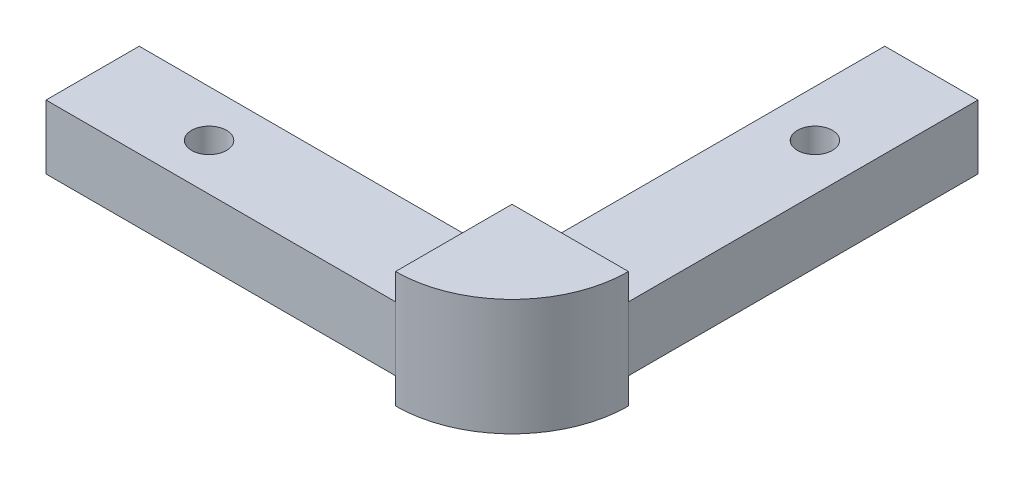
ISO-10303-21;
HEADER;
FILE_DESCRIPTION(('STEP AP214'),'2;1');
FILE_NAME('part.step','',(''),(''),'','','');
FILE_SCHEMA(('AUTOMOTIVE_DESIGN { 1 0 10303 214 1 1 1 1 }'));
ENDSEC;
DATA;
#1=APPLICATION_CONTEXT('core data for automotive mechanical design processes');
#2=APPLICATION_PROTOCOL_DEFINITION('international standard','automotive_design',2000,#1);
#3=PRODUCT_CONTEXT('',#1,'mechanical');
#4=PRODUCT('Part','Part','',(#3));
#5=PRODUCT_RELATED_PRODUCT_CATEGORY('part','',(#4));
#6=PRODUCT_DEFINITION_FORMATION('','',#4);
#7=PRODUCT_DEFINITION_CONTEXT('part definition',#1,'design');
#8=PRODUCT_DEFINITION('design','',#6,#7);
#9=PRODUCT_DEFINITION_SHAPE('','',#8);
#10=(LENGTH_UNIT() NAMED_UNIT(*) SI_UNIT(.MILLI.,.METRE.));
#11=(NAMED_UNIT(*) PLANE_ANGLE_UNIT() SI_UNIT($,.RADIAN.));
#12=(NAMED_UNIT(*) SI_UNIT($,.STERADIAN.) SOLID_ANGLE_UNIT());
#13=UNCERTAINTY_MEASURE_WITH_UNIT(LENGTH_MEASURE(1.E-05),#10,'distance_accuracy_value','');
#14=(GEOMETRIC_REPRESENTATION_CONTEXT(3) GLOBAL_UNCERTAINTY_ASSIGNED_CONTEXT((#13)) GLOBAL_UNIT_ASSIGNED_CONTEXT((#10,
#11,#12)) REPRESENTATION_CONTEXT('',''));
#15=CARTESIAN_POINT('',(0.,0.,0.));
#16=DIRECTION('',(0.,0.,1.));
#17=DIRECTION('',(1.,0.,0.));
#18=AXIS2_PLACEMENT_3D('',#15,#16,#17);
#19=CARTESIAN_POINT('',(-34.3342103379576,5.5,-14.7736082004496));
#20=DIRECTION('',(0.,1.,0.));
#21=DIRECTION('',(0.,0.,1.));
#22=AXIS2_PLACEMENT_3D('',#19,#20,#21);
#23=PLANE('',#22);
#24=CARTESIAN_POINT('',(-54.3342103379576,5.5,-8.77360820044956));
#25=DIRECTION('',(0.,1.,0.));
#26=DIRECTION('',(0.,0.,1.));
#27=AXIS2_PLACEMENT_3D('',#24,#25,#26);
#28=CIRCLE('',#27,1.5);
#29=CARTESIAN_POINT('',(-54.3342103379576,5.5,-7.27360820044956));
#30=VERTEX_POINT('',#29);
#31=EDGE_CURVE('E187',#30,#30,#28,.T.);
#32=ORIENTED_EDGE('',*,*,#31,.F.);
#33=EDGE_LOOP('',(#32));
#34=FACE_BOUND('',#33,.T.);
#35=DIRECTION('',(0.,0.,1.));
#36=VECTOR('',#35,1.);
#37=CARTESIAN_POINT('',(-34.3342103379576,5.5,-14.7736082004496));
#38=LINE('',#37,#36);
#39=CARTESIAN_POINT('',(-34.3342103379576,5.5,-12.7736082004496));
#40=VERTEX_POINT('',#39);
#41=CARTESIAN_POINT('',(-34.3342103379576,5.5,-4.77360820044956));
#42=VERTEX_POINT('',#41);
#43=EDGE_CURVE('E98',#40,#42,#38,.T.);
#44=ORIENTED_EDGE('',*,*,#43,.F.);
#45=DIRECTION('',(-1.,0.,0.));
#46=VECTOR('',#45,1.);
#47=CARTESIAN_POINT('',(-34.3342103379576,5.5,-12.7736082004496));
#48=LINE('',#47,#46);
#49=CARTESIAN_POINT('',(-64.3342103379576,5.5,-12.7736082004496));
#50=VERTEX_POINT('',#49);
#51=EDGE_CURVE('E154',#40,#50,#48,.T.);
#52=ORIENTED_EDGE('',*,*,#51,.T.);
#53=DIRECTION('',(0.,0.,1.));
#54=VECTOR('',#53,1.);
#55=CARTESIAN_POINT('',(-64.3342103379576,5.5,-4.77360820044956));
#56=LINE('',#55,#54);
#57=CARTESIAN_POINT('',(-64.3342103379576,5.5,-4.77360820044956));
#58=VERTEX_POINT('',#57);
#59=EDGE_CURVE('E241',#50,#58,#56,.T.);
#60=ORIENTED_EDGE('',*,*,#59,.T.);
#61=DIRECTION('',(1.,0.,0.));
#62=VECTOR('',#61,1.);
#63=CARTESIAN_POINT('',(-34.3342103379576,5.5,-4.77360820044957));
#64=LINE('',#63,#62);
#65=EDGE_CURVE('E120',#58,#42,#64,.T.);
#66=ORIENTED_EDGE('',*,*,#65,.T.);
#67=EDGE_LOOP('',(#44,#52,#60,#66));
#68=FACE_BOUND('',#67,.T.);
#69=ADVANCED_FACE('F41',(#34,#68),#23,.T.);
#70=CARTESIAN_POINT('',(-34.3342103379576,0.,-14.7736082004496));
#71=DIRECTION('',(0.,1.,0.));
#72=DIRECTION('',(0.,0.,1.));
#73=AXIS2_PLACEMENT_3D('',#70,#71,#72);
#74=PLANE('',#73);
#75=CARTESIAN_POINT('',(-54.3342103379576,0.,-8.77360820044956));
#76=DIRECTION('',(0.,1.,0.));
#77=DIRECTION('',(0.,0.,1.));
#78=AXIS2_PLACEMENT_3D('',#75,#76,#77);
#79=CIRCLE('',#78,1.5);
#80=CARTESIAN_POINT('',(-54.3342103379576,0.,-7.27360820044956));
#81=VERTEX_POINT('',#80);
#82=EDGE_CURVE('E45',#81,#81,#79,.T.);
#83=ORIENTED_EDGE('',*,*,#82,.T.);
#84=EDGE_LOOP('',(#83));
#85=FACE_BOUND('',#84,.T.);
#86=DIRECTION('',(-1.,0.,0.));
#87=VECTOR('',#86,1.);
#88=CARTESIAN_POINT('',(-34.3342103379576,0.,-12.7736082004496));
#89=LINE('',#88,#87);
#90=CARTESIAN_POINT('',(-34.3342103379576,0.,-12.7736082004496));
#91=VERTEX_POINT('',#90);
#92=CARTESIAN_POINT('',(-64.3342103379576,0.,-12.7736082004496));
#93=VERTEX_POINT('',#92);
#94=EDGE_CURVE('E136',#91,#93,#89,.T.);
#95=ORIENTED_EDGE('',*,*,#94,.F.);
#96=DIRECTION('',(0.,0.,1.));
#97=VECTOR('',#96,1.);
#98=CARTESIAN_POINT('',(-34.3342103379576,0.,-14.7736082004496));
#99=LINE('',#98,#97);
#100=CARTESIAN_POINT('',(-34.3342103379576,0.,-4.77360820044957));
#101=VERTEX_POINT('',#100);
#102=EDGE_CURVE('E11',#91,#101,#99,.T.);
#103=ORIENTED_EDGE('',*,*,#102,.T.);
#104=DIRECTION('',(1.,0.,0.));
#105=VECTOR('',#104,1.);
#106=CARTESIAN_POINT('',(-34.3342103379576,0.,-4.77360820044957));
#107=LINE('',#106,#105);
#108=CARTESIAN_POINT('',(-64.3342103379576,0.,-4.77360820044956));
#109=VERTEX_POINT('',#108);
#110=EDGE_CURVE('E142',#109,#101,#107,.T.);
#111=ORIENTED_EDGE('',*,*,#110,.F.);
#112=DIRECTION('',(0.,0.,1.));
#113=VECTOR('',#112,1.);
#114=CARTESIAN_POINT('',(-64.3342103379576,0.,-4.77360820044956));
#115=LINE('',#114,#113);
#116=EDGE_CURVE('E139',#93,#109,#115,.T.);
#117=ORIENTED_EDGE('',*,*,#116,.F.);
#118=EDGE_LOOP('',(#95,#103,#111,#117));
#119=FACE_BOUND('',#118,.T.);
#120=ADVANCED_FACE('F297',(#85,#119),#74,.F.);
#121=CARTESIAN_POINT('',(-34.3342103379576,5.5,-14.7736082004496));
#122=DIRECTION('',(1.,0.,0.));
#123=DIRECTION('',(0.,0.,-1.));
#124=AXIS2_PLACEMENT_3D('',#121,#122,#123);
#125=PLANE('',#124);
#126=DIRECTION('',(0.,-1.,0.));
#127=VECTOR('',#126,1.);
#128=CARTESIAN_POINT('',(-34.3342103379576,5.5,-14.7736082004496));
#129=LINE('',#128,#127);
#130=CARTESIAN_POINT('',(-34.3342103379576,7.75,-14.7736082004496));
#131=VERTEX_POINT('',#130);
#132=CARTESIAN_POINT('',(-34.3342103379576,-2.25,-14.7736082004496));
#133=VERTEX_POINT('',#132);
#134=EDGE_CURVE('E132',#131,#133,#129,.T.);
#135=ORIENTED_EDGE('',*,*,#134,.T.);
#136=DIRECTION('',(0.,0.,1.));
#137=VECTOR('',#136,1.);
#138=CARTESIAN_POINT('',(-34.3342103379576,-2.25,-14.7736082004496));
#139=LINE('',#138,#137);
#140=CARTESIAN_POINT('',(-34.3342103379576,-2.25,-4.77360820044957));
#141=VERTEX_POINT('',#140);
#142=EDGE_CURVE('E214',#133,#141,#139,.T.);
#143=ORIENTED_EDGE('',*,*,#142,.T.);
#144=DIRECTION('',(0.,1.,0.));
#145=VECTOR('',#144,1.);
#146=CARTESIAN_POINT('',(-34.3342103379576,-2.25,-4.77360820044957));
#147=LINE('',#146,#145);
#148=EDGE_CURVE('E231',#141,#101,#147,.T.);
#149=ORIENTED_EDGE('',*,*,#148,.T.);
#150=ORIENTED_EDGE('',*,*,#102,.F.);
#151=DIRECTION('',(0.,-1.,0.));
#152=VECTOR('',#151,1.);
#153=CARTESIAN_POINT('',(-34.3342103379576,5.5,-12.7736082004496));
#154=LINE('',#153,#152);
#155=EDGE_CURVE('E178',#40,#91,#154,.T.);
#156=ORIENTED_EDGE('',*,*,#155,.F.);
#157=ORIENTED_EDGE('',*,*,#43,.T.);
#158=CARTESIAN_POINT('',(-34.3342103379576,7.75,-4.77360820044957));
#159=VERTEX_POINT('',#158);
#160=EDGE_CURVE('E226',#42,#159,#147,.T.);
#161=ORIENTED_EDGE('',*,*,#160,.T.);
#162=DIRECTION('',(0.,0.,1.));
#163=VECTOR('',#162,1.);
#164=CARTESIAN_POINT('',(-34.3342103379576,7.75,-14.7736082004496));
#165=LINE('',#164,#163);
#166=EDGE_CURVE('E193',#131,#159,#165,.T.);
#167=ORIENTED_EDGE('',*,*,#166,.F.);
#168=EDGE_LOOP('',(#135,#143,#149,#150,#156,#157,#161,#167));
#169=FACE_BOUND('',#168,.T.);
#170=ADVANCED_FACE('F43',(#169),#125,.F.);
#171=CARTESIAN_POINT('',(-34.3342103379576,5.5,-12.7736082004496));
#172=DIRECTION('',(0.,0.,1.));
#173=DIRECTION('',(1.,0.,0.));
#174=AXIS2_PLACEMENT_3D('',#171,#172,#173);
#175=PLANE('',#174);
#176=ORIENTED_EDGE('',*,*,#94,.T.);
#177=DIRECTION('',(0.,-1.,0.));
#178=VECTOR('',#177,1.);
#179=CARTESIAN_POINT('',(-64.3342103379576,5.5,-12.7736082004496));
#180=LINE('',#179,#178);
#181=EDGE_CURVE('E174',#50,#93,#180,.T.);
#182=ORIENTED_EDGE('',*,*,#181,.F.);
#183=ORIENTED_EDGE('',*,*,#51,.F.);
#184=ORIENTED_EDGE('',*,*,#155,.T.);
#185=EDGE_LOOP('',(#176,#182,#183,#184));
#186=FACE_BOUND('',#185,.T.);
#187=ADVANCED_FACE('F300',(#186),#175,.F.);
#188=CARTESIAN_POINT('',(-64.3342103379576,5.5,-4.77360820044956));
#189=DIRECTION('',(1.,0.,0.));
#190=DIRECTION('',(0.,0.,-1.));
#191=AXIS2_PLACEMENT_3D('',#188,#189,#190);
#192=PLANE('',#191);
#193=ORIENTED_EDGE('',*,*,#116,.T.);
#194=DIRECTION('',(0.,-1.,0.));
#195=VECTOR('',#194,1.);
#196=CARTESIAN_POINT('',(-64.3342103379576,5.5,-4.77360820044956));
#197=LINE('',#196,#195);
#198=EDGE_CURVE('E170',#58,#109,#197,.T.);
#199=ORIENTED_EDGE('',*,*,#198,.F.);
#200=ORIENTED_EDGE('',*,*,#59,.F.);
#201=ORIENTED_EDGE('',*,*,#181,.T.);
#202=EDGE_LOOP('',(#193,#199,#200,#201));
#203=FACE_BOUND('',#202,.T.);
#204=ADVANCED_FACE('F302',(#203),#192,.F.);
#205=CARTESIAN_POINT('',(-34.3342103379576,5.5,-4.77360820044957));
#206=DIRECTION('',(0.,0.,-1.));
#207=DIRECTION('',(-1.,0.,0.));
#208=AXIS2_PLACEMENT_3D('',#205,#206,#207);
#209=PLANE('',#208);
#210=ORIENTED_EDGE('',*,*,#110,.T.);
#211=DIRECTION('',(0.,-1.,0.));
#212=VECTOR('',#211,1.);
#213=CARTESIAN_POINT('',(-34.3342103379576,5.5,-4.77360820044956));
#214=LINE('',#213,#212);
#215=EDGE_CURVE('E166',#42,#101,#214,.T.);
#216=ORIENTED_EDGE('',*,*,#215,.F.);
#217=ORIENTED_EDGE('',*,*,#65,.F.);
#218=ORIENTED_EDGE('',*,*,#198,.T.);
#219=EDGE_LOOP('',(#210,#216,#217,#218));
#220=FACE_BOUND('',#219,.T.);
#221=ADVANCED_FACE('F249',(#220),#209,.F.);
#222=CARTESIAN_POINT('',(-34.3342103379576,5.5,-14.7736082004496));
#223=DIRECTION('',(0.,-1.,0.));
#224=DIRECTION('',(0.,0.,-1.));
#225=AXIS2_PLACEMENT_3D('',#222,#223,#224);
#226=CYLINDRICAL_SURFACE('',#225,10.);
#227=ORIENTED_EDGE('',*,*,#215,.T.);
#228=ORIENTED_EDGE('',*,*,#148,.F.);
#229=CARTESIAN_POINT('',(-34.3342103379576,-2.25,-14.7736082004496));
#230=DIRECTION('',(0.,1.,0.));
#231=DIRECTION('',(0.,0.,1.));
#232=AXIS2_PLACEMENT_3D('',#229,#230,#231);
#233=CIRCLE('',#232,10.);
#234=CARTESIAN_POINT('',(-24.3342103379576,-2.25,-14.7736082004496));
#235=VERTEX_POINT('',#234);
#236=EDGE_CURVE('E218',#141,#235,#233,.T.);
#237=ORIENTED_EDGE('',*,*,#236,.T.);
#238=DIRECTION('',(0.,1.,0.));
#239=VECTOR('',#238,1.);
#240=CARTESIAN_POINT('',(-24.3342103379576,-2.25,-14.7736082004496));
#241=LINE('',#240,#239);
#242=CARTESIAN_POINT('',(-24.3342103379576,0.,-14.7736082004496));
#243=VERTEX_POINT('',#242);
#244=EDGE_CURVE('E227',#235,#243,#241,.T.);
#245=ORIENTED_EDGE('',*,*,#244,.T.);
#246=DIRECTION('',(0.,-1.,0.));
#247=VECTOR('',#246,1.);
#248=CARTESIAN_POINT('',(-24.3342103379576,5.5,-14.7736082004496));
#249=LINE('',#248,#247);
#250=CARTESIAN_POINT('',(-24.3342103379576,5.5,-14.7736082004496));
#251=VERTEX_POINT('',#250);
#252=EDGE_CURVE('E125',#251,#243,#249,.T.);
#253=ORIENTED_EDGE('',*,*,#252,.F.);
#254=CARTESIAN_POINT('',(-24.3342103379576,7.75,-14.7736082004496));
#255=VERTEX_POINT('',#254);
#256=EDGE_CURVE('E230',#251,#255,#241,.T.);
#257=ORIENTED_EDGE('',*,*,#256,.T.);
#258=CARTESIAN_POINT('',(-34.3342103379576,7.75,-14.7736082004496));
#259=DIRECTION('',(0.,1.,0.));
#260=DIRECTION('',(0.,0.,1.));
#261=AXIS2_PLACEMENT_3D('',#258,#259,#260);
#262=CIRCLE('',#261,10.);
#263=EDGE_CURVE('E206',#159,#255,#262,.T.);
#264=ORIENTED_EDGE('',*,*,#263,.F.);
#265=ORIENTED_EDGE('',*,*,#160,.F.);
#266=EDGE_LOOP('',(#227,#228,#237,#245,#253,#257,#264,#265));
#267=FACE_BOUND('',#266,.T.);
#268=ADVANCED_FACE('F262',(#267),#226,.T.);
#269=CARTESIAN_POINT('',(-24.3342103379576,5.5,-14.7736082004496));
#270=DIRECTION('',(-1.,0.,0.));
#271=DIRECTION('',(0.,0.,1.));
#272=AXIS2_PLACEMENT_3D('',#269,#270,#271);
#273=PLANE('',#272);
#274=DIRECTION('',(0.,0.,-1.));
#275=VECTOR('',#274,1.);
#276=CARTESIAN_POINT('',(-24.3342103379576,0.,-14.7736082004496));
#277=LINE('',#276,#275);
#278=CARTESIAN_POINT('',(-24.3342103379576,0.,-44.7736082004496));
#279=VERTEX_POINT('',#278);
#280=EDGE_CURVE('E82',#243,#279,#277,.T.);
#281=ORIENTED_EDGE('',*,*,#280,.T.);
#282=DIRECTION('',(0.,-1.,0.));
#283=VECTOR('',#282,1.);
#284=CARTESIAN_POINT('',(-24.3342103379576,5.5,-44.7736082004496));
#285=LINE('',#284,#283);
#286=CARTESIAN_POINT('',(-24.3342103379576,5.5,-44.7736082004496));
#287=VERTEX_POINT('',#286);
#288=EDGE_CURVE('E122',#287,#279,#285,.T.);
#289=ORIENTED_EDGE('',*,*,#288,.F.);
#290=DIRECTION('',(0.,0.,-1.));
#291=VECTOR('',#290,1.);
#292=CARTESIAN_POINT('',(-24.3342103379576,5.5,-14.7736082004496));
#293=LINE('',#292,#291);
#294=EDGE_CURVE('E110',#251,#287,#293,.T.);
#295=ORIENTED_EDGE('',*,*,#294,.F.);
#296=ORIENTED_EDGE('',*,*,#252,.T.);
#297=EDGE_LOOP('',(#281,#289,#295,#296));
#298=FACE_BOUND('',#297,.T.);
#299=ADVANCED_FACE('F123',(#298),#273,.F.);
#300=CARTESIAN_POINT('',(-24.3342103379576,5.5,-44.7736082004496));
#301=DIRECTION('',(0.,0.,1.));
#302=DIRECTION('',(1.,0.,0.));
#303=AXIS2_PLACEMENT_3D('',#300,#301,#302);
#304=PLANE('',#303);
#305=DIRECTION('',(-1.,0.,0.));
#306=VECTOR('',#305,1.);
#307=CARTESIAN_POINT('',(-24.3342103379576,0.,-44.7736082004496));
#308=LINE('',#307,#306);
#309=CARTESIAN_POINT('',(-32.3342103379576,0.,-44.7736082004496));
#310=VERTEX_POINT('',#309);
#311=EDGE_CURVE('E89',#279,#310,#308,.T.);
#312=ORIENTED_EDGE('',*,*,#311,.T.);
#313=DIRECTION('',(0.,-1.,0.));
#314=VECTOR('',#313,1.);
#315=CARTESIAN_POINT('',(-32.3342103379576,5.5,-44.7736082004496));
#316=LINE('',#315,#314);
#317=CARTESIAN_POINT('',(-32.3342103379576,5.5,-44.7736082004496));
#318=VERTEX_POINT('',#317);
#319=EDGE_CURVE('E126',#318,#310,#316,.T.);
#320=ORIENTED_EDGE('',*,*,#319,.F.);
#321=DIRECTION('',(-1.,0.,0.));
#322=VECTOR('',#321,1.);
#323=CARTESIAN_POINT('',(-24.3342103379576,5.5,-44.7736082004496));
#324=LINE('',#323,#322);
#325=EDGE_CURVE('E113',#287,#318,#324,.T.);
#326=ORIENTED_EDGE('',*,*,#325,.F.);
#327=ORIENTED_EDGE('',*,*,#288,.T.);
#328=EDGE_LOOP('',(#312,#320,#326,#327));
#329=FACE_BOUND('',#328,.T.);
#330=ADVANCED_FACE('F128',(#329),#304,.F.);
#331=CARTESIAN_POINT('',(-32.3342103379576,5.5,-14.7736082004496));
#332=DIRECTION('',(1.,0.,0.));
#333=DIRECTION('',(0.,0.,-1.));
#334=AXIS2_PLACEMENT_3D('',#331,#332,#333);
#335=PLANE('',#334);
#336=DIRECTION('',(0.,0.,1.));
#337=VECTOR('',#336,1.);
#338=CARTESIAN_POINT('',(-32.3342103379576,0.,-14.7736082004496));
#339=LINE('',#338,#337);
#340=CARTESIAN_POINT('',(-32.3342103379576,0.,-14.7736082004496));
#341=VERTEX_POINT('',#340);
#342=EDGE_CURVE('E150',#310,#341,#339,.T.);
#343=ORIENTED_EDGE('',*,*,#342,.T.);
#344=DIRECTION('',(0.,-1.,0.));
#345=VECTOR('',#344,1.);
#346=CARTESIAN_POINT('',(-32.3342103379576,5.5,-14.7736082004496));
#347=LINE('',#346,#345);
#348=CARTESIAN_POINT('',(-32.3342103379576,5.5,-14.7736082004496));
#349=VERTEX_POINT('',#348);
#350=EDGE_CURVE('E158',#349,#341,#347,.T.);
#351=ORIENTED_EDGE('',*,*,#350,.F.);
#352=DIRECTION('',(0.,0.,1.));
#353=VECTOR('',#352,1.);
#354=CARTESIAN_POINT('',(-32.3342103379576,5.5,-14.7736082004496));
#355=LINE('',#354,#353);
#356=EDGE_CURVE('E61',#318,#349,#355,.T.);
#357=ORIENTED_EDGE('',*,*,#356,.F.);
#358=ORIENTED_EDGE('',*,*,#319,.T.);
#359=EDGE_LOOP('',(#343,#351,#357,#358));
#360=FACE_BOUND('',#359,.T.);
#361=ADVANCED_FACE('F326',(#360),#335,.F.);
#362=CARTESIAN_POINT('',(-34.3342103379576,5.5,-14.7736082004496));
#363=DIRECTION('',(0.,0.,1.));
#364=DIRECTION('',(1.,0.,0.));
#365=AXIS2_PLACEMENT_3D('',#362,#363,#364);
#366=PLANE('',#365);
#367=ORIENTED_EDGE('',*,*,#350,.T.);
#368=DIRECTION('',(-1.,0.,0.));
#369=VECTOR('',#368,1.);
#370=CARTESIAN_POINT('',(-34.3342103379576,0.,-14.7736082004496));
#371=LINE('',#370,#369);
#372=EDGE_CURVE('E52',#243,#341,#371,.T.);
#373=ORIENTED_EDGE('',*,*,#372,.F.);
#374=ORIENTED_EDGE('',*,*,#244,.F.);
#375=DIRECTION('',(-1.,0.,0.));
#376=VECTOR('',#375,1.);
#377=CARTESIAN_POINT('',(-34.3342103379576,-2.25,-14.7736082004496));
#378=LINE('',#377,#376);
#379=EDGE_CURVE('E222',#235,#133,#378,.T.);
#380=ORIENTED_EDGE('',*,*,#379,.T.);
#381=ORIENTED_EDGE('',*,*,#134,.F.);
#382=DIRECTION('',(-1.,0.,0.));
#383=VECTOR('',#382,1.);
#384=CARTESIAN_POINT('',(-34.3342103379576,7.75,-14.7736082004496));
#385=LINE('',#384,#383);
#386=EDGE_CURVE('E210',#255,#131,#385,.T.);
#387=ORIENTED_EDGE('',*,*,#386,.F.);
#388=ORIENTED_EDGE('',*,*,#256,.F.);
#389=DIRECTION('',(-1.,0.,0.));
#390=VECTOR('',#389,1.);
#391=CARTESIAN_POINT('',(-34.3342103379576,5.5,-14.7736082004496));
#392=LINE('',#391,#390);
#393=EDGE_CURVE('E116',#251,#349,#392,.T.);
#394=ORIENTED_EDGE('',*,*,#393,.T.);
#395=EDGE_LOOP('',(#367,#373,#374,#380,#381,#387,#388,#394));
#396=FACE_BOUND('',#395,.T.);
#397=ADVANCED_FACE('F274',(#396),#366,.F.);
#398=CARTESIAN_POINT('',(-28.3342103379576,5.5,-34.7736082004496));
#399=DIRECTION('',(0.,1.,0.));
#400=DIRECTION('',(0.,0.,1.));
#401=AXIS2_PLACEMENT_3D('',#398,#399,#400);
#402=CIRCLE('',#401,1.5);
#403=CARTESIAN_POINT('',(-28.3342103379576,5.5,-33.2736082004496));
#404=VERTEX_POINT('',#403);
#405=EDGE_CURVE('E195',#404,#404,#402,.T.);
#406=ORIENTED_EDGE('',*,*,#405,.F.);
#407=EDGE_LOOP('',(#406));
#408=FACE_BOUND('',#407,.T.);
#409=ORIENTED_EDGE('',*,*,#393,.F.);
#410=ORIENTED_EDGE('',*,*,#294,.T.);
#411=ORIENTED_EDGE('',*,*,#325,.T.);
#412=ORIENTED_EDGE('',*,*,#356,.T.);
#413=EDGE_LOOP('',(#409,#410,#411,#412));
#414=FACE_BOUND('',#413,.T.);
#415=ADVANCED_FACE('F111',(#408,#414),#23,.T.);
#416=CARTESIAN_POINT('',(-28.3342103379576,0.,-34.7736082004496));
#417=DIRECTION('',(0.,1.,0.));
#418=DIRECTION('',(0.,0.,1.));
#419=AXIS2_PLACEMENT_3D('',#416,#417,#418);
#420=CIRCLE('',#419,1.5);
#421=CARTESIAN_POINT('',(-28.3342103379576,0.,-33.2736082004496));
#422=VERTEX_POINT('',#421);
#423=EDGE_CURVE('E184',#422,#422,#420,.T.);
#424=ORIENTED_EDGE('',*,*,#423,.T.);
#425=EDGE_LOOP('',(#424));
#426=FACE_BOUND('',#425,.T.);
#427=ORIENTED_EDGE('',*,*,#280,.F.);
#428=ORIENTED_EDGE('',*,*,#372,.T.);
#429=ORIENTED_EDGE('',*,*,#342,.F.);
#430=ORIENTED_EDGE('',*,*,#311,.F.);
#431=EDGE_LOOP('',(#427,#428,#429,#430));
#432=FACE_BOUND('',#431,.T.);
#433=ADVANCED_FACE('F318',(#426,#432),#74,.F.);
#434=CARTESIAN_POINT('',(-34.3342103379576,-2.25,-14.7736082004496));
#435=DIRECTION('',(0.,1.,0.));
#436=DIRECTION('',(0.,0.,1.));
#437=AXIS2_PLACEMENT_3D('',#434,#435,#436);
#438=PLANE('',#437);
#439=ORIENTED_EDGE('',*,*,#142,.F.);
#440=ORIENTED_EDGE('',*,*,#379,.F.);
#441=ORIENTED_EDGE('',*,*,#236,.F.);
#442=EDGE_LOOP('',(#439,#440,#441));
#443=FACE_BOUND('',#442,.T.);
#444=ADVANCED_FACE('F285',(#443),#438,.F.);
#445=CARTESIAN_POINT('',(-34.3342103379576,7.75,-14.7736082004496));
#446=DIRECTION('',(0.,1.,0.));
#447=DIRECTION('',(0.,0.,1.));
#448=AXIS2_PLACEMENT_3D('',#445,#446,#447);
#449=PLANE('',#448);
#450=ORIENTED_EDGE('',*,*,#166,.T.);
#451=ORIENTED_EDGE('',*,*,#263,.T.);
#452=ORIENTED_EDGE('',*,*,#386,.T.);
#453=EDGE_LOOP('',(#450,#451,#452));
#454=FACE_BOUND('',#453,.T.);
#455=ADVANCED_FACE('F272',(#454),#449,.T.);
#456=CARTESIAN_POINT('',(-28.3342103379576,-4.5,-34.7736082004496));
#457=DIRECTION('',(0.,1.,0.));
#458=DIRECTION('',(0.,0.,1.));
#459=AXIS2_PLACEMENT_3D('',#456,#457,#458);
#460=CYLINDRICAL_SURFACE('',#459,1.5);
#461=ORIENTED_EDGE('',*,*,#405,.T.);
#462=EDGE_LOOP('',(#461));
#463=FACE_BOUND('',#462,.T.);
#464=ORIENTED_EDGE('',*,*,#423,.F.);
#465=EDGE_LOOP('',(#464));
#466=FACE_BOUND('',#465,.T.);
#467=ADVANCED_FACE('F330',(#463,#466),#460,.F.);
#468=CARTESIAN_POINT('',(-54.3342103379576,-4.5,-8.77360820044956));
#469=DIRECTION('',(0.,1.,0.));
#470=DIRECTION('',(0.,0.,1.));
#471=AXIS2_PLACEMENT_3D('',#468,#469,#470);
#472=CYLINDRICAL_SURFACE('',#471,1.5);
#473=ORIENTED_EDGE('',*,*,#31,.T.);
#474=EDGE_LOOP('',(#473));
#475=FACE_BOUND('',#474,.T.);
#476=ORIENTED_EDGE('',*,*,#82,.F.);
#477=EDGE_LOOP('',(#476));
#478=FACE_BOUND('',#477,.T.);
#479=ADVANCED_FACE('F333',(#475,#478),#472,.F.);
#480=CLOSED_SHELL('',(#69,#120,#170,#187,#204,#221,#268,#299,#330,#361,#397,#415,#433,#444,#455,
#467,#479));
#481=MANIFOLD_SOLID_BREP('B2',#480);
#482=ADVANCED_BREP_SHAPE_REPRESENTATION('',(#18,#481),#14);
#483=SHAPE_DEFINITION_REPRESENTATION(#9,#482);
ENDSEC;
END-ISO-10303-21;
